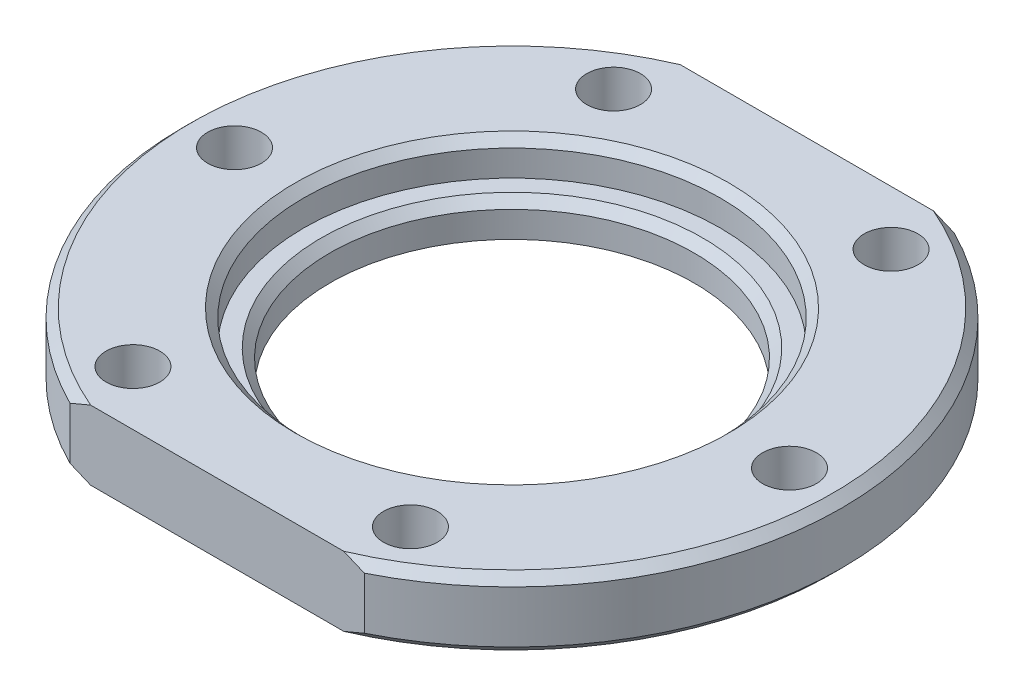
ISO-10303-21;
HEADER;
FILE_DESCRIPTION(('STEP AP214'),'2;1');
FILE_NAME('part.step','',(''),(''),'','','');
FILE_SCHEMA(('AUTOMOTIVE_DESIGN { 1 0 10303 214 1 1 1 1 }'));
ENDSEC;
DATA;
#1=APPLICATION_CONTEXT('core data for automotive mechanical design processes');
#2=APPLICATION_PROTOCOL_DEFINITION('international standard','automotive_design',2000,#1);
#3=PRODUCT_CONTEXT('',#1,'mechanical');
#4=PRODUCT('Part','Part','',(#3));
#5=PRODUCT_RELATED_PRODUCT_CATEGORY('part','',(#4));
#6=PRODUCT_DEFINITION_FORMATION('','',#4);
#7=PRODUCT_DEFINITION_CONTEXT('part definition',#1,'design');
#8=PRODUCT_DEFINITION('design','',#6,#7);
#9=PRODUCT_DEFINITION_SHAPE('','',#8);
#10=(LENGTH_UNIT() NAMED_UNIT(*) SI_UNIT(.MILLI.,.METRE.));
#11=(NAMED_UNIT(*) PLANE_ANGLE_UNIT() SI_UNIT($,.RADIAN.));
#12=(NAMED_UNIT(*) SI_UNIT($,.STERADIAN.) SOLID_ANGLE_UNIT());
#13=UNCERTAINTY_MEASURE_WITH_UNIT(LENGTH_MEASURE(1.E-05),#10,'distance_accuracy_value','');
#14=(GEOMETRIC_REPRESENTATION_CONTEXT(3) GLOBAL_UNCERTAINTY_ASSIGNED_CONTEXT((#13)) GLOBAL_UNIT_ASSIGNED_CONTEXT((#10,
#11,#12)) REPRESENTATION_CONTEXT('',''));
#15=CARTESIAN_POINT('',(0.,0.,0.));
#16=DIRECTION('',(0.,0.,1.));
#17=DIRECTION('',(1.,0.,0.));
#18=AXIS2_PLACEMENT_3D('',#15,#16,#17);
#19=CARTESIAN_POINT('',(0.,4.,0.));
#20=DIRECTION('',(0.,-1.,0.));
#21=DIRECTION('',(0.,0.,-1.));
#22=AXIS2_PLACEMENT_3D('',#19,#20,#21);
#23=CYLINDRICAL_SURFACE('',#22,10.5);
#24=CARTESIAN_POINT('',(0.,1.49999999999999,0.));
#25=DIRECTION('',(0.,1.,0.));
#26=DIRECTION('',(0.,0.,1.));
#27=AXIS2_PLACEMENT_3D('',#24,#25,#26);
#28=CIRCLE('',#27,10.5);
#29=CARTESIAN_POINT('',(0.,1.49999999999999,10.5));
#30=VERTEX_POINT('',#29);
#31=EDGE_CURVE('E148',#30,#30,#28,.T.);
#32=ORIENTED_EDGE('',*,*,#31,.T.);
#33=EDGE_LOOP('',(#32));
#34=FACE_BOUND('',#33,.T.);
#35=CARTESIAN_POINT('',(0.,0.,0.));
#36=DIRECTION('',(0.,1.,0.));
#37=DIRECTION('',(0.,0.,1.));
#38=AXIS2_PLACEMENT_3D('',#35,#36,#37);
#39=CIRCLE('',#38,10.5);
#40=CARTESIAN_POINT('',(0.,0.,10.5));
#41=VERTEX_POINT('',#40);
#42=EDGE_CURVE('E134',#41,#41,#39,.T.);
#43=ORIENTED_EDGE('',*,*,#42,.F.);
#44=EDGE_LOOP('',(#43));
#45=FACE_BOUND('',#44,.T.);
#46=ADVANCED_FACE('F35',(#34,#45),#23,.F.);
#47=CARTESIAN_POINT('',(0.,4.,0.));
#48=DIRECTION('',(0.,1.,0.));
#49=DIRECTION('',(0.,0.,1.));
#50=AXIS2_PLACEMENT_3D('',#47,#48,#49);
#51=PLANE('',#50);
#52=CARTESIAN_POINT('',(0.,4.,0.));
#53=DIRECTION('',(0.,1.,0.));
#54=DIRECTION('',(0.,0.,1.));
#55=AXIS2_PLACEMENT_3D('',#52,#53,#54);
#56=CIRCLE('',#55,12.5);
#57=CARTESIAN_POINT('',(0.,4.,12.5));
#58=VERTEX_POINT('',#57);
#59=EDGE_CURVE('E157',#58,#58,#56,.F.);
#60=ORIENTED_EDGE('',*,*,#59,.T.);
#61=EDGE_LOOP('',(#60));
#62=FACE_BOUND('',#61,.T.);
#63=CARTESIAN_POINT('',(7.99999999999987,4.,13.8564064605511));
#64=DIRECTION('',(0.,1.,0.));
#65=DIRECTION('',(0.,0.,1.));
#66=AXIS2_PLACEMENT_3D('',#63,#64,#65);
#67=CIRCLE('',#66,1.55);
#68=CARTESIAN_POINT('',(7.99999999999987,4.,15.4064064605511));
#69=VERTEX_POINT('',#68);
#70=EDGE_CURVE('E327',#69,#69,#67,.T.);
#71=ORIENTED_EDGE('',*,*,#70,.F.);
#72=EDGE_LOOP('',(#71));
#73=FACE_BOUND('',#72,.T.);
#74=CARTESIAN_POINT('',(8.00000000000007,4.,-13.856406460551));
#75=DIRECTION('',(0.,1.,0.));
#76=DIRECTION('',(0.,0.,1.));
#77=AXIS2_PLACEMENT_3D('',#74,#75,#76);
#78=CIRCLE('',#77,1.55);
#79=CARTESIAN_POINT('',(8.00000000000007,4.,-12.306406460551));
#80=VERTEX_POINT('',#79);
#81=EDGE_CURVE('E339',#80,#80,#78,.T.);
#82=ORIENTED_EDGE('',*,*,#81,.F.);
#83=EDGE_LOOP('',(#82));
#84=FACE_BOUND('',#83,.T.);
#85=CARTESIAN_POINT('',(-16.,4.,0.));
#86=DIRECTION('',(0.,1.,0.));
#87=DIRECTION('',(0.,0.,1.));
#88=AXIS2_PLACEMENT_3D('',#85,#86,#87);
#89=CIRCLE('',#88,1.55);
#90=CARTESIAN_POINT('',(-16.,4.,1.55));
#91=VERTEX_POINT('',#90);
#92=EDGE_CURVE('E351',#91,#91,#89,.T.);
#93=ORIENTED_EDGE('',*,*,#92,.F.);
#94=EDGE_LOOP('',(#93));
#95=FACE_BOUND('',#94,.T.);
#96=DIRECTION('',(1.,0.,0.));
#97=VECTOR('',#96,1.);
#98=CARTESIAN_POINT('',(-8.48528137423857,4.,17.));
#99=LINE('',#98,#97);
#100=CARTESIAN_POINT('',(-7.29725975966325,4.,17.));
#101=VERTEX_POINT('',#100);
#102=CARTESIAN_POINT('',(7.29725975966324,4.,17.));
#103=VERTEX_POINT('',#102);
#104=EDGE_CURVE('E114',#101,#103,#99,.T.);
#105=ORIENTED_EDGE('',*,*,#104,.T.);
#106=CARTESIAN_POINT('',(0.,4.,0.));
#107=DIRECTION('',(0.,1.,0.));
#108=DIRECTION('',(0.,0.,1.));
#109=AXIS2_PLACEMENT_3D('',#106,#107,#108);
#110=CIRCLE('',#109,18.5);
#111=CARTESIAN_POINT('',(7.29725975966324,4.,-17.));
#112=VERTEX_POINT('',#111);
#113=EDGE_CURVE('E118',#103,#112,#110,.T.);
#114=ORIENTED_EDGE('',*,*,#113,.T.);
#115=DIRECTION('',(-1.,0.,0.));
#116=VECTOR('',#115,1.);
#117=CARTESIAN_POINT('',(-8.48528137423857,4.,-17.));
#118=LINE('',#117,#116);
#119=CARTESIAN_POINT('',(-7.29725975966325,4.,-17.));
#120=VERTEX_POINT('',#119);
#121=EDGE_CURVE('E117',#112,#120,#118,.T.);
#122=ORIENTED_EDGE('',*,*,#121,.T.);
#123=CARTESIAN_POINT('',(0.,4.,0.));
#124=DIRECTION('',(0.,1.,0.));
#125=DIRECTION('',(0.,0.,1.));
#126=AXIS2_PLACEMENT_3D('',#123,#124,#125);
#127=CIRCLE('',#126,18.5);
#128=EDGE_CURVE('E105',#120,#101,#127,.T.);
#129=ORIENTED_EDGE('',*,*,#128,.T.);
#130=EDGE_LOOP('',(#105,#114,#122,#129));
#131=FACE_BOUND('',#130,.T.);
#132=CARTESIAN_POINT('',(-7.99999999999997,4.,-13.856406460551));
#133=DIRECTION('',(0.,1.,0.));
#134=DIRECTION('',(0.,0.,1.));
#135=AXIS2_PLACEMENT_3D('',#132,#133,#134);
#136=CIRCLE('',#135,1.55);
#137=CARTESIAN_POINT('',(-7.99999999999997,4.,-12.306406460551));
#138=VERTEX_POINT('',#137);
#139=EDGE_CURVE('E345',#138,#138,#136,.T.);
#140=ORIENTED_EDGE('',*,*,#139,.F.);
#141=EDGE_LOOP('',(#140));
#142=FACE_BOUND('',#141,.T.);
#143=CARTESIAN_POINT('',(16.,4.,1.1172740284298E-13));
#144=DIRECTION('',(0.,1.,0.));
#145=DIRECTION('',(0.,0.,1.));
#146=AXIS2_PLACEMENT_3D('',#143,#144,#145);
#147=CIRCLE('',#146,1.55);
#148=CARTESIAN_POINT('',(16.,4.,1.55000000000011));
#149=VERTEX_POINT('',#148);
#150=EDGE_CURVE('E333',#149,#149,#147,.T.);
#151=ORIENTED_EDGE('',*,*,#150,.F.);
#152=EDGE_LOOP('',(#151));
#153=FACE_BOUND('',#152,.T.);
#154=CARTESIAN_POINT('',(-8.00000000000016,4.,13.8564064605509));
#155=DIRECTION('',(0.,1.,0.));
#156=DIRECTION('',(0.,0.,1.));
#157=AXIS2_PLACEMENT_3D('',#154,#155,#156);
#158=CIRCLE('',#157,1.55);
#159=CARTESIAN_POINT('',(-8.00000000000016,4.,15.4064064605509));
#160=VERTEX_POINT('',#159);
#161=EDGE_CURVE('E321',#160,#160,#158,.T.);
#162=ORIENTED_EDGE('',*,*,#161,.F.);
#163=EDGE_LOOP('',(#162));
#164=FACE_BOUND('',#163,.T.);
#165=ADVANCED_FACE('F111',(#62,#73,#84,#95,#131,#142,#153,#164),#51,.T.);
#166=CARTESIAN_POINT('',(0.,0.,0.));
#167=DIRECTION('',(0.,1.,0.));
#168=DIRECTION('',(0.,0.,1.));
#169=AXIS2_PLACEMENT_3D('',#166,#167,#168);
#170=PLANE('',#169);
#171=DIRECTION('',(-1.,0.,0.));
#172=VECTOR('',#171,1.);
#173=CARTESIAN_POINT('',(-8.48528137423857,0.,-17.));
#174=LINE('',#173,#172);
#175=CARTESIAN_POINT('',(7.29725975966322,0.,-17.));
#176=VERTEX_POINT('',#175);
#177=CARTESIAN_POINT('',(-7.29725975966322,0.,-17.));
#178=VERTEX_POINT('',#177);
#179=EDGE_CURVE('E126',#176,#178,#174,.T.);
#180=ORIENTED_EDGE('',*,*,#179,.F.);
#181=CARTESIAN_POINT('',(0.,0.,0.));
#182=DIRECTION('',(0.,1.,0.));
#183=DIRECTION('',(0.,0.,1.));
#184=AXIS2_PLACEMENT_3D('',#181,#182,#183);
#185=CIRCLE('',#184,18.5);
#186=CARTESIAN_POINT('',(7.29725975966322,0.,17.));
#187=VERTEX_POINT('',#186);
#188=EDGE_CURVE('E106',#176,#187,#185,.F.);
#189=ORIENTED_EDGE('',*,*,#188,.T.);
#190=DIRECTION('',(1.,0.,0.));
#191=VECTOR('',#190,1.);
#192=CARTESIAN_POINT('',(-8.48528137423857,0.,17.));
#193=LINE('',#192,#191);
#194=CARTESIAN_POINT('',(-7.29725975966322,0.,17.));
#195=VERTEX_POINT('',#194);
#196=EDGE_CURVE('E131',#195,#187,#193,.T.);
#197=ORIENTED_EDGE('',*,*,#196,.F.);
#198=CARTESIAN_POINT('',(0.,0.,0.));
#199=DIRECTION('',(0.,1.,0.));
#200=DIRECTION('',(0.,0.,1.));
#201=AXIS2_PLACEMENT_3D('',#198,#199,#200);
#202=CIRCLE('',#201,18.5);
#203=EDGE_CURVE('E250',#195,#178,#202,.F.);
#204=ORIENTED_EDGE('',*,*,#203,.T.);
#205=EDGE_LOOP('',(#180,#189,#197,#204));
#206=FACE_BOUND('',#205,.T.);
#207=ORIENTED_EDGE('',*,*,#42,.T.);
#208=EDGE_LOOP('',(#207));
#209=FACE_BOUND('',#208,.T.);
#210=CARTESIAN_POINT('',(-16.,0.,0.));
#211=DIRECTION('',(0.,1.,0.));
#212=DIRECTION('',(0.,0.,1.));
#213=AXIS2_PLACEMENT_3D('',#210,#211,#212);
#214=CIRCLE('',#213,1.55);
#215=CARTESIAN_POINT('',(-16.,0.,1.55));
#216=VERTEX_POINT('',#215);
#217=EDGE_CURVE('E348',#216,#216,#214,.T.);
#218=ORIENTED_EDGE('',*,*,#217,.T.);
#219=EDGE_LOOP('',(#218));
#220=FACE_BOUND('',#219,.T.);
#221=CARTESIAN_POINT('',(-7.99999999999997,0.,-13.856406460551));
#222=DIRECTION('',(0.,1.,0.));
#223=DIRECTION('',(0.,0.,1.));
#224=AXIS2_PLACEMENT_3D('',#221,#222,#223);
#225=CIRCLE('',#224,1.55);
#226=CARTESIAN_POINT('',(-7.99999999999997,0.,-12.306406460551));
#227=VERTEX_POINT('',#226);
#228=EDGE_CURVE('E342',#227,#227,#225,.T.);
#229=ORIENTED_EDGE('',*,*,#228,.T.);
#230=EDGE_LOOP('',(#229));
#231=FACE_BOUND('',#230,.T.);
#232=CARTESIAN_POINT('',(8.00000000000007,0.,-13.856406460551));
#233=DIRECTION('',(0.,1.,0.));
#234=DIRECTION('',(0.,0.,1.));
#235=AXIS2_PLACEMENT_3D('',#232,#233,#234);
#236=CIRCLE('',#235,1.55);
#237=CARTESIAN_POINT('',(8.00000000000007,0.,-12.306406460551));
#238=VERTEX_POINT('',#237);
#239=EDGE_CURVE('E336',#238,#238,#236,.T.);
#240=ORIENTED_EDGE('',*,*,#239,.T.);
#241=EDGE_LOOP('',(#240));
#242=FACE_BOUND('',#241,.T.);
#243=CARTESIAN_POINT('',(16.,0.,1.1172740284298E-13));
#244=DIRECTION('',(0.,1.,0.));
#245=DIRECTION('',(0.,0.,1.));
#246=AXIS2_PLACEMENT_3D('',#243,#244,#245);
#247=CIRCLE('',#246,1.55);
#248=CARTESIAN_POINT('',(16.,0.,1.55000000000011));
#249=VERTEX_POINT('',#248);
#250=EDGE_CURVE('E330',#249,#249,#247,.T.);
#251=ORIENTED_EDGE('',*,*,#250,.T.);
#252=EDGE_LOOP('',(#251));
#253=FACE_BOUND('',#252,.T.);
#254=CARTESIAN_POINT('',(7.99999999999987,0.,13.8564064605511));
#255=DIRECTION('',(0.,1.,0.));
#256=DIRECTION('',(0.,0.,1.));
#257=AXIS2_PLACEMENT_3D('',#254,#255,#256);
#258=CIRCLE('',#257,1.55);
#259=CARTESIAN_POINT('',(7.99999999999987,0.,15.4064064605511));
#260=VERTEX_POINT('',#259);
#261=EDGE_CURVE('E325',#260,#260,#258,.T.);
#262=ORIENTED_EDGE('',*,*,#261,.T.);
#263=EDGE_LOOP('',(#262));
#264=FACE_BOUND('',#263,.T.);
#265=CARTESIAN_POINT('',(-8.00000000000016,0.,13.8564064605509));
#266=DIRECTION('',(0.,1.,0.));
#267=DIRECTION('',(0.,0.,1.));
#268=AXIS2_PLACEMENT_3D('',#265,#266,#267);
#269=CIRCLE('',#268,1.55);
#270=CARTESIAN_POINT('',(-8.00000000000016,0.,15.4064064605509));
#271=VERTEX_POINT('',#270);
#272=EDGE_CURVE('E318',#271,#271,#269,.T.);
#273=ORIENTED_EDGE('',*,*,#272,.T.);
#274=EDGE_LOOP('',(#273));
#275=FACE_BOUND('',#274,.T.);
#276=ADVANCED_FACE('F186',(#206,#209,#220,#231,#242,#253,#264,#275),#170,.F.);
#277=CARTESIAN_POINT('',(0.,4.,0.));
#278=DIRECTION('',(0.,-1.,0.));
#279=DIRECTION('',(0.,0.,-1.));
#280=AXIS2_PLACEMENT_3D('',#277,#278,#279);
#281=CYLINDRICAL_SURFACE('',#280,19.);
#282=DIRECTION('',(0.,-1.,0.));
#283=VECTOR('',#282,1.);
#284=CARTESIAN_POINT('',(-8.48528137423857,4.,-17.));
#285=LINE('',#284,#283);
#286=CARTESIAN_POINT('',(-8.48528137423857,3.50000000000001,-17.));
#287=VERTEX_POINT('',#286);
#288=CARTESIAN_POINT('',(-8.48528137423857,0.499999999999997,-17.));
#289=VERTEX_POINT('',#288);
#290=EDGE_CURVE('E128',#287,#289,#285,.T.);
#291=ORIENTED_EDGE('',*,*,#290,.T.);
#292=CARTESIAN_POINT('',(0.,0.499999999999997,0.));
#293=DIRECTION('',(0.,1.,0.));
#294=DIRECTION('',(0.,0.,1.));
#295=AXIS2_PLACEMENT_3D('',#292,#293,#294);
#296=CIRCLE('',#295,19.);
#297=CARTESIAN_POINT('',(-8.48528137423857,0.499999999999997,17.));
#298=VERTEX_POINT('',#297);
#299=EDGE_CURVE('E11',#289,#298,#296,.T.);
#300=ORIENTED_EDGE('',*,*,#299,.T.);
#301=DIRECTION('',(0.,-1.,0.));
#302=VECTOR('',#301,1.);
#303=CARTESIAN_POINT('',(-8.48528137423857,4.,17.));
#304=LINE('',#303,#302);
#305=CARTESIAN_POINT('',(-8.48528137423857,3.50000000000001,17.));
#306=VERTEX_POINT('',#305);
#307=EDGE_CURVE('E146',#306,#298,#304,.T.);
#308=ORIENTED_EDGE('',*,*,#307,.F.);
#309=CARTESIAN_POINT('',(0.,3.50000000000001,0.));
#310=DIRECTION('',(0.,1.,0.));
#311=DIRECTION('',(0.,0.,1.));
#312=AXIS2_PLACEMENT_3D('',#309,#310,#311);
#313=CIRCLE('',#312,19.);
#314=EDGE_CURVE('E45',#306,#287,#313,.F.);
#315=ORIENTED_EDGE('',*,*,#314,.T.);
#316=EDGE_LOOP('',(#291,#300,#308,#315));
#317=FACE_BOUND('',#316,.T.);
#318=ADVANCED_FACE('F240',(#317),#281,.T.);
#319=CARTESIAN_POINT('',(-8.48528137423857,4.,17.));
#320=DIRECTION('',(0.,0.,-1.));
#321=DIRECTION('',(-1.,0.,0.));
#322=AXIS2_PLACEMENT_3D('',#319,#320,#321);
#323=PLANE('',#322);
#324=ORIENTED_EDGE('',*,*,#196,.T.);
#325=CARTESIAN_POINT('',(7.29725975966322,0.,17.));
#326=CARTESIAN_POINT('',(7.39719487948352,0.0394191850347753,17.));
#327=CARTESIAN_POINT('',(7.4968962262143,0.0794296704768808,17.));
#328=CARTESIAN_POINT('',(7.69582202053383,0.160584933755773,17.));
#329=CARTESIAN_POINT('',(7.79504652511087,0.201729571878801,17.));
#330=CARTESIAN_POINT('',(7.99303326311037,0.285114298994633,17.));
#331=CARTESIAN_POINT('',(8.09179549900561,0.327354382119744,17.));
#332=CARTESIAN_POINT('',(8.2888745500227,0.412894043845014,17.));
#333=CARTESIAN_POINT('',(8.38719130902525,0.456193751762999,17.));
#334=CARTESIAN_POINT('',(8.48528137423857,0.499999999999986,17.));
#335=B_SPLINE_CURVE_WITH_KNOTS('',3,(#325,#326,#327,#328,#329,#330,#331,#332,#333,#334),
.UNSPECIFIED.,.F.,.F.,(4,2,2,2,4),(0.,0.322283148753811,0.644526772037848,0.966768669597223,
1.28905009200687),.UNSPECIFIED.);
#336=CARTESIAN_POINT('',(8.48528137423857,0.499999999999997,17.));
#337=VERTEX_POINT('',#336);
#338=EDGE_CURVE('E228',#187,#337,#335,.T.);
#339=ORIENTED_EDGE('',*,*,#338,.T.);
#340=DIRECTION('',(0.,-1.,0.));
#341=VECTOR('',#340,1.);
#342=CARTESIAN_POINT('',(8.48528137423857,4.,17.));
#343=LINE('',#342,#341);
#344=CARTESIAN_POINT('',(8.48528137423857,3.50000000000001,17.));
#345=VERTEX_POINT('',#344);
#346=EDGE_CURVE('E143',#345,#337,#343,.T.);
#347=ORIENTED_EDGE('',*,*,#346,.F.);
#348=CARTESIAN_POINT('',(8.48528137423857,3.50000000000001,17.));
#349=CARTESIAN_POINT('',(8.38719130902525,3.543806248237,17.));
#350=CARTESIAN_POINT('',(8.2888745500227,3.58710595615499,17.));
#351=CARTESIAN_POINT('',(8.09179549900562,3.67264561788026,17.));
#352=CARTESIAN_POINT('',(7.99303326311038,3.71488570100537,17.));
#353=CARTESIAN_POINT('',(7.79504652511089,3.7982704281212,17.));
#354=CARTESIAN_POINT('',(7.69582202053385,3.83941506624423,17.));
#355=CARTESIAN_POINT('',(7.49689622621432,3.92057032952313,17.));
#356=CARTESIAN_POINT('',(7.39719487948355,3.96058081496524,17.));
#357=CARTESIAN_POINT('',(7.29725975966326,4.00000000000003,17.));
#358=B_SPLINE_CURVE_WITH_KNOTS('',3,(#348,#349,#350,#351,#352,#353,#354,#355,#356,#357),
.UNSPECIFIED.,.F.,.F.,(4,2,2,2,4),(0.,0.322281422409644,0.644523319969013,0.966766943253042,
1.28905009200685),.UNSPECIFIED.);
#359=EDGE_CURVE('E125',#345,#103,#358,.T.);
#360=ORIENTED_EDGE('',*,*,#359,.T.);
#361=ORIENTED_EDGE('',*,*,#104,.F.);
#362=CARTESIAN_POINT('',(-7.29725975966325,4.,17.));
#363=CARTESIAN_POINT('',(-7.39719487948355,3.96058081496523,17.));
#364=CARTESIAN_POINT('',(-7.49689622621433,3.92057032952312,17.));
#365=CARTESIAN_POINT('',(-7.69582202053386,3.83941506624423,17.));
#366=CARTESIAN_POINT('',(-7.79504652511089,3.7982704281212,17.));
#367=CARTESIAN_POINT('',(-7.99303326311039,3.71488570100537,17.));
#368=CARTESIAN_POINT('',(-8.09179549900562,3.67264561788026,17.));
#369=CARTESIAN_POINT('',(-8.2888745500227,3.58710595615499,17.));
#370=CARTESIAN_POINT('',(-8.38719130902525,3.543806248237,17.));
#371=CARTESIAN_POINT('',(-8.48528137423857,3.50000000000002,17.));
#372=B_SPLINE_CURVE_WITH_KNOTS('',3,(#362,#363,#364,#365,#366,#367,#368,#369,#370,#371),
.UNSPECIFIED.,.F.,.F.,(4,2,2,2,4),(0.,0.322283148753804,0.644526772037832,0.9667686695972,
1.28905009200684),.UNSPECIFIED.);
#373=EDGE_CURVE('E59',#101,#306,#372,.T.);
#374=ORIENTED_EDGE('',*,*,#373,.T.);
#375=ORIENTED_EDGE('',*,*,#307,.T.);
#376=CARTESIAN_POINT('',(-8.48528137423857,0.499999999999997,17.));
#377=CARTESIAN_POINT('',(-8.38719130902525,0.456193751763005,17.));
#378=CARTESIAN_POINT('',(-8.28887455002269,0.412894043845016,17.));
#379=CARTESIAN_POINT('',(-8.09179549900561,0.327354382119743,17.));
#380=CARTESIAN_POINT('',(-7.99303326311037,0.285114298994632,17.));
#381=CARTESIAN_POINT('',(-7.79504652511087,0.201729571878802,17.));
#382=CARTESIAN_POINT('',(-7.69582202053383,0.160584933755776,17.));
#383=CARTESIAN_POINT('',(-7.4968962262143,0.0794296704768802,17.));
#384=CARTESIAN_POINT('',(-7.39719487948352,0.0394191850347685,17.));
#385=CARTESIAN_POINT('',(-7.29725975966323,0.,17.));
#386=B_SPLINE_CURVE_WITH_KNOTS('',3,(#376,#377,#378,#379,#380,#381,#382,#383,#384,#385),
.UNSPECIFIED.,.F.,.F.,(4,2,2,2,4),(0.,0.32228142240965,0.644523319969026,0.966766943253061,
1.28905009200687),.UNSPECIFIED.);
#387=EDGE_CURVE('E52',#298,#195,#386,.T.);
#388=ORIENTED_EDGE('',*,*,#387,.T.);
#389=EDGE_LOOP('',(#324,#339,#347,#360,#361,#374,#375,#388));
#390=FACE_BOUND('',#389,.T.);
#391=ADVANCED_FACE('F122',(#390),#323,.F.);
#392=CARTESIAN_POINT('',(0.,4.,0.));
#393=DIRECTION('',(0.,-1.,0.));
#394=DIRECTION('',(0.,0.,-1.));
#395=AXIS2_PLACEMENT_3D('',#392,#393,#394);
#396=CYLINDRICAL_SURFACE('',#395,19.);
#397=ORIENTED_EDGE('',*,*,#346,.T.);
#398=CARTESIAN_POINT('',(0.,0.499999999999997,0.));
#399=DIRECTION('',(0.,1.,0.));
#400=DIRECTION('',(0.,0.,1.));
#401=AXIS2_PLACEMENT_3D('',#398,#399,#400);
#402=CIRCLE('',#401,19.);
#403=CARTESIAN_POINT('',(8.48528137423856,0.499999999999997,-17.));
#404=VERTEX_POINT('',#403);
#405=EDGE_CURVE('E162',#337,#404,#402,.T.);
#406=ORIENTED_EDGE('',*,*,#405,.T.);
#407=DIRECTION('',(0.,-1.,0.));
#408=VECTOR('',#407,1.);
#409=CARTESIAN_POINT('',(8.48528137423856,4.,-17.));
#410=LINE('',#409,#408);
#411=CARTESIAN_POINT('',(8.48528137423856,3.50000000000001,-17.));
#412=VERTEX_POINT('',#411);
#413=EDGE_CURVE('E140',#412,#404,#410,.T.);
#414=ORIENTED_EDGE('',*,*,#413,.F.);
#415=CARTESIAN_POINT('',(0.,3.50000000000001,0.));
#416=DIRECTION('',(0.,1.,0.));
#417=DIRECTION('',(0.,0.,1.));
#418=AXIS2_PLACEMENT_3D('',#415,#416,#417);
#419=CIRCLE('',#418,19.);
#420=EDGE_CURVE('E160',#412,#345,#419,.F.);
#421=ORIENTED_EDGE('',*,*,#420,.T.);
#422=EDGE_LOOP('',(#397,#406,#414,#421));
#423=FACE_BOUND('',#422,.T.);
#424=ADVANCED_FACE('F184',(#423),#396,.T.);
#425=CARTESIAN_POINT('',(-8.48528137423857,4.,-17.));
#426=DIRECTION('',(0.,0.,1.));
#427=DIRECTION('',(1.,0.,0.));
#428=AXIS2_PLACEMENT_3D('',#425,#426,#427);
#429=PLANE('',#428);
#430=ORIENTED_EDGE('',*,*,#413,.T.);
#431=CARTESIAN_POINT('',(8.48528137423856,0.499999999999997,-17.));
#432=CARTESIAN_POINT('',(8.38719130902525,0.456193751763001,-17.));
#433=CARTESIAN_POINT('',(8.28887455002269,0.412894043845012,-17.));
#434=CARTESIAN_POINT('',(8.09179549900561,0.327354382119741,-17.));
#435=CARTESIAN_POINT('',(7.99303326311037,0.285114298994632,-17.));
#436=CARTESIAN_POINT('',(7.79504652511087,0.201729571878802,-17.));
#437=CARTESIAN_POINT('',(7.69582202053383,0.160584933755774,-17.));
#438=CARTESIAN_POINT('',(7.4968962262143,0.0794296704768765,-17.));
#439=CARTESIAN_POINT('',(7.39719487948352,0.0394191850347649,-17.));
#440=CARTESIAN_POINT('',(7.29725975966323,0.,-17.));
#441=B_SPLINE_CURVE_WITH_KNOTS('',3,(#431,#432,#433,#434,#435,#436,#437,#438,#439,#440),
.UNSPECIFIED.,.F.,.F.,(4,2,2,2,4),(0.,0.322281422409649,0.644523319969026,0.966766943253061,
1.28905009200687),.UNSPECIFIED.);
#442=EDGE_CURVE('E199',#404,#176,#441,.T.);
#443=ORIENTED_EDGE('',*,*,#442,.T.);
#444=ORIENTED_EDGE('',*,*,#179,.T.);
#445=CARTESIAN_POINT('',(-7.29725975966322,0.,-17.));
#446=CARTESIAN_POINT('',(-7.39719487948352,0.0394191850347753,-17.));
#447=CARTESIAN_POINT('',(-7.4968962262143,0.0794296704768808,-17.));
#448=CARTESIAN_POINT('',(-7.69582202053383,0.160584933755773,-17.));
#449=CARTESIAN_POINT('',(-7.79504652511087,0.201729571878801,-17.));
#450=CARTESIAN_POINT('',(-7.99303326311037,0.285114298994633,-17.));
#451=CARTESIAN_POINT('',(-8.09179549900561,0.327354382119744,-17.));
#452=CARTESIAN_POINT('',(-8.2888745500227,0.412894043845014,-17.));
#453=CARTESIAN_POINT('',(-8.38719130902525,0.456193751762999,-17.));
#454=CARTESIAN_POINT('',(-8.48528137423857,0.499999999999986,-17.));
#455=B_SPLINE_CURVE_WITH_KNOTS('',3,(#445,#446,#447,#448,#449,#450,#451,#452,#453,#454),
.UNSPECIFIED.,.F.,.F.,(4,2,2,2,4),(0.,0.322283148753811,0.644526772037848,0.966768669597223,
1.28905009200687),.UNSPECIFIED.);
#456=EDGE_CURVE('E172',#178,#289,#455,.T.);
#457=ORIENTED_EDGE('',*,*,#456,.T.);
#458=ORIENTED_EDGE('',*,*,#290,.F.);
#459=CARTESIAN_POINT('',(-8.48528137423857,3.50000000000001,-17.));
#460=CARTESIAN_POINT('',(-8.38719130902525,3.543806248237,-17.));
#461=CARTESIAN_POINT('',(-8.2888745500227,3.58710595615499,-17.));
#462=CARTESIAN_POINT('',(-8.09179549900563,3.67264561788026,-17.));
#463=CARTESIAN_POINT('',(-7.99303326311039,3.71488570100537,-17.));
#464=CARTESIAN_POINT('',(-7.79504652511089,3.7982704281212,-17.));
#465=CARTESIAN_POINT('',(-7.69582202053386,3.83941506624423,-17.));
#466=CARTESIAN_POINT('',(-7.49689622621433,3.92057032952312,-17.));
#467=CARTESIAN_POINT('',(-7.39719487948355,3.96058081496524,-17.));
#468=CARTESIAN_POINT('',(-7.29725975966326,4.00000000000003,-17.));
#469=B_SPLINE_CURVE_WITH_KNOTS('',3,(#459,#460,#461,#462,#463,#464,#465,#466,#467,#468),
.UNSPECIFIED.,.F.,.F.,(4,2,2,2,4),(0.,0.32228142240964,0.644523319969009,0.966766943253038,
1.28905009200684),.UNSPECIFIED.);
#470=EDGE_CURVE('E165',#287,#120,#469,.T.);
#471=ORIENTED_EDGE('',*,*,#470,.T.);
#472=ORIENTED_EDGE('',*,*,#121,.F.);
#473=CARTESIAN_POINT('',(7.29725975966324,4.,-17.));
#474=CARTESIAN_POINT('',(7.39719487948354,3.96058081496523,-17.));
#475=CARTESIAN_POINT('',(7.49689622621432,3.92057032952313,-17.));
#476=CARTESIAN_POINT('',(7.69582202053385,3.83941506624423,-17.));
#477=CARTESIAN_POINT('',(7.79504652511088,3.7982704281212,-17.));
#478=CARTESIAN_POINT('',(7.99303326311038,3.71488570100537,-17.));
#479=CARTESIAN_POINT('',(8.09179549900562,3.67264561788026,-17.));
#480=CARTESIAN_POINT('',(8.2888745500227,3.58710595615499,-17.));
#481=CARTESIAN_POINT('',(8.38719130902525,3.54380624823701,-17.));
#482=CARTESIAN_POINT('',(8.48528137423857,3.50000000000002,-17.));
#483=B_SPLINE_CURVE_WITH_KNOTS('',3,(#473,#474,#475,#476,#477,#478,#479,#480,#481,#482),
.UNSPECIFIED.,.F.,.F.,(4,2,2,2,4),(0.,0.322283148753804,0.644526772037834,0.966768669597203,
1.28905009200684),.UNSPECIFIED.);
#484=EDGE_CURVE('E193',#112,#412,#483,.T.);
#485=ORIENTED_EDGE('',*,*,#484,.T.);
#486=EDGE_LOOP('',(#430,#443,#444,#457,#458,#471,#472,#485));
#487=FACE_BOUND('',#486,.T.);
#488=ADVANCED_FACE('F178',(#487),#429,.F.);
#489=CARTESIAN_POINT('',(-16.,4.,0.));
#490=DIRECTION('',(0.,-1.,0.));
#491=DIRECTION('',(0.,0.,-1.));
#492=AXIS2_PLACEMENT_3D('',#489,#490,#491);
#493=CYLINDRICAL_SURFACE('',#492,1.55);
#494=ORIENTED_EDGE('',*,*,#92,.T.);
#495=EDGE_LOOP('',(#494));
#496=FACE_BOUND('',#495,.T.);
#497=ORIENTED_EDGE('',*,*,#217,.F.);
#498=EDGE_LOOP('',(#497));
#499=FACE_BOUND('',#498,.T.);
#500=ADVANCED_FACE('F183',(#496,#499),#493,.F.);
#501=CARTESIAN_POINT('',(-7.99999999999997,4.,-13.856406460551));
#502=DIRECTION('',(0.,-1.,0.));
#503=DIRECTION('',(0.,0.,-1.));
#504=AXIS2_PLACEMENT_3D('',#501,#502,#503);
#505=CYLINDRICAL_SURFACE('',#504,1.55);
#506=ORIENTED_EDGE('',*,*,#139,.T.);
#507=EDGE_LOOP('',(#506));
#508=FACE_BOUND('',#507,.T.);
#509=ORIENTED_EDGE('',*,*,#228,.F.);
#510=EDGE_LOOP('',(#509));
#511=FACE_BOUND('',#510,.T.);
#512=ADVANCED_FACE('F278',(#508,#511),#505,.F.);
#513=CARTESIAN_POINT('',(8.00000000000007,4.,-13.856406460551));
#514=DIRECTION('',(0.,-1.,0.));
#515=DIRECTION('',(0.,0.,-1.));
#516=AXIS2_PLACEMENT_3D('',#513,#514,#515);
#517=CYLINDRICAL_SURFACE('',#516,1.55);
#518=ORIENTED_EDGE('',*,*,#81,.T.);
#519=EDGE_LOOP('',(#518));
#520=FACE_BOUND('',#519,.T.);
#521=ORIENTED_EDGE('',*,*,#239,.F.);
#522=EDGE_LOOP('',(#521));
#523=FACE_BOUND('',#522,.T.);
#524=ADVANCED_FACE('F282',(#520,#523),#517,.F.);
#525=CARTESIAN_POINT('',(16.,4.,1.1172740284298E-13));
#526=DIRECTION('',(0.,-1.,0.));
#527=DIRECTION('',(0.,0.,-1.));
#528=AXIS2_PLACEMENT_3D('',#525,#526,#527);
#529=CYLINDRICAL_SURFACE('',#528,1.55);
#530=ORIENTED_EDGE('',*,*,#150,.T.);
#531=EDGE_LOOP('',(#530));
#532=FACE_BOUND('',#531,.T.);
#533=ORIENTED_EDGE('',*,*,#250,.F.);
#534=EDGE_LOOP('',(#533));
#535=FACE_BOUND('',#534,.T.);
#536=ADVANCED_FACE('F286',(#532,#535),#529,.F.);
#537=CARTESIAN_POINT('',(7.99999999999987,4.,13.8564064605511));
#538=DIRECTION('',(0.,-1.,0.));
#539=DIRECTION('',(0.,0.,-1.));
#540=AXIS2_PLACEMENT_3D('',#537,#538,#539);
#541=CYLINDRICAL_SURFACE('',#540,1.55);
#542=ORIENTED_EDGE('',*,*,#70,.T.);
#543=EDGE_LOOP('',(#542));
#544=FACE_BOUND('',#543,.T.);
#545=ORIENTED_EDGE('',*,*,#261,.F.);
#546=EDGE_LOOP('',(#545));
#547=FACE_BOUND('',#546,.T.);
#548=ADVANCED_FACE('F290',(#544,#547),#541,.F.);
#549=CARTESIAN_POINT('',(-8.00000000000016,4.,13.8564064605509));
#550=DIRECTION('',(0.,-1.,0.));
#551=DIRECTION('',(0.,0.,-1.));
#552=AXIS2_PLACEMENT_3D('',#549,#550,#551);
#553=CYLINDRICAL_SURFACE('',#552,1.55);
#554=ORIENTED_EDGE('',*,*,#161,.T.);
#555=EDGE_LOOP('',(#554));
#556=FACE_BOUND('',#555,.T.);
#557=ORIENTED_EDGE('',*,*,#272,.F.);
#558=EDGE_LOOP('',(#557));
#559=FACE_BOUND('',#558,.T.);
#560=ADVANCED_FACE('F294',(#556,#559),#553,.F.);
#561=CARTESIAN_POINT('',(0.,2.,0.));
#562=DIRECTION('',(0.,1.,0.));
#563=DIRECTION('',(0.,0.,1.));
#564=AXIS2_PLACEMENT_3D('',#561,#562,#563);
#565=CYLINDRICAL_SURFACE('',#564,12.);
#566=CARTESIAN_POINT('',(0.,3.49999999999999,0.));
#567=DIRECTION('',(0.,1.,0.));
#568=DIRECTION('',(0.,0.,1.));
#569=AXIS2_PLACEMENT_3D('',#566,#567,#568);
#570=CIRCLE('',#569,12.);
#571=CARTESIAN_POINT('',(0.,3.49999999999999,12.));
#572=VERTEX_POINT('',#571);
#573=EDGE_CURVE('E119',#572,#572,#570,.T.);
#574=ORIENTED_EDGE('',*,*,#573,.T.);
#575=EDGE_LOOP('',(#574));
#576=FACE_BOUND('',#575,.T.);
#577=CARTESIAN_POINT('',(0.,2.,0.));
#578=DIRECTION('',(0.,1.,0.));
#579=DIRECTION('',(0.,0.,1.));
#580=AXIS2_PLACEMENT_3D('',#577,#578,#579);
#581=CIRCLE('',#580,12.);
#582=CARTESIAN_POINT('',(0.,2.,12.));
#583=VERTEX_POINT('',#582);
#584=EDGE_CURVE('E316',#583,#583,#581,.T.);
#585=ORIENTED_EDGE('',*,*,#584,.F.);
#586=EDGE_LOOP('',(#585));
#587=FACE_BOUND('',#586,.T.);
#588=ADVANCED_FACE('F298',(#576,#587),#565,.F.);
#589=CARTESIAN_POINT('',(0.,2.,0.));
#590=DIRECTION('',(0.,1.,0.));
#591=DIRECTION('',(0.,0.,1.));
#592=AXIS2_PLACEMENT_3D('',#589,#590,#591);
#593=PLANE('',#592);
#594=CARTESIAN_POINT('',(0.,2.,0.));
#595=DIRECTION('',(0.,1.,0.));
#596=DIRECTION('',(0.,0.,1.));
#597=AXIS2_PLACEMENT_3D('',#594,#595,#596);
#598=CIRCLE('',#597,11.);
#599=CARTESIAN_POINT('',(0.,2.,11.));
#600=VERTEX_POINT('',#599);
#601=EDGE_CURVE('E151',#600,#600,#598,.F.);
#602=ORIENTED_EDGE('',*,*,#601,.T.);
#603=EDGE_LOOP('',(#602));
#604=FACE_BOUND('',#603,.T.);
#605=ORIENTED_EDGE('',*,*,#584,.T.);
#606=EDGE_LOOP('',(#605));
#607=FACE_BOUND('',#606,.T.);
#608=ADVANCED_FACE('F302',(#604,#607),#593,.T.);
#609=CARTESIAN_POINT('',(0.,1.49999999999999,0.));
#610=DIRECTION('',(0.,1.,0.));
#611=DIRECTION('',(0.,0.,1.));
#612=AXIS2_PLACEMENT_3D('',#609,#610,#611);
#613=CONICAL_SURFACE('',#612,10.5,0.785398163397452);
#614=ORIENTED_EDGE('',*,*,#601,.F.);
#615=EDGE_LOOP('',(#614));
#616=FACE_BOUND('',#615,.T.);
#617=ORIENTED_EDGE('',*,*,#31,.F.);
#618=EDGE_LOOP('',(#617));
#619=FACE_BOUND('',#618,.T.);
#620=ADVANCED_FACE('F305',(#616,#619),#613,.F.);
#621=CARTESIAN_POINT('',(0.,3.49999999999999,0.));
#622=DIRECTION('',(0.,1.,0.));
#623=DIRECTION('',(0.,0.,1.));
#624=AXIS2_PLACEMENT_3D('',#621,#622,#623);
#625=CONICAL_SURFACE('',#624,12.,0.785398163397455);
#626=ORIENTED_EDGE('',*,*,#59,.F.);
#627=EDGE_LOOP('',(#626));
#628=FACE_BOUND('',#627,.T.);
#629=ORIENTED_EDGE('',*,*,#573,.F.);
#630=EDGE_LOOP('',(#629));
#631=FACE_BOUND('',#630,.T.);
#632=ADVANCED_FACE('F310',(#628,#631),#625,.F.);
#633=CARTESIAN_POINT('',(0.,0.499999999999997,0.));
#634=DIRECTION('',(0.,1.,0.));
#635=DIRECTION('',(0.,0.,1.));
#636=AXIS2_PLACEMENT_3D('',#633,#634,#635);
#637=CONICAL_SURFACE('',#636,19.,0.785398163397452);
#638=ORIENTED_EDGE('',*,*,#338,.F.);
#639=ORIENTED_EDGE('',*,*,#188,.F.);
#640=ORIENTED_EDGE('',*,*,#442,.F.);
#641=ORIENTED_EDGE('',*,*,#405,.F.);
#642=EDGE_LOOP('',(#638,#639,#640,#641));
#643=FACE_BOUND('',#642,.T.);
#644=ADVANCED_FACE('F215',(#643),#637,.T.);
#645=CARTESIAN_POINT('',(0.,4.,0.));
#646=DIRECTION('',(0.,-1.,0.));
#647=DIRECTION('',(0.,0.,-1.));
#648=AXIS2_PLACEMENT_3D('',#645,#646,#647);
#649=CONICAL_SURFACE('',#648,18.5,0.785398163397438);
#650=ORIENTED_EDGE('',*,*,#359,.F.);
#651=ORIENTED_EDGE('',*,*,#420,.F.);
#652=ORIENTED_EDGE('',*,*,#484,.F.);
#653=ORIENTED_EDGE('',*,*,#113,.F.);
#654=EDGE_LOOP('',(#650,#651,#652,#653));
#655=FACE_BOUND('',#654,.T.);
#656=ADVANCED_FACE('F207',(#655),#649,.T.);
#657=CARTESIAN_POINT('',(0.,0.499999999999997,0.));
#658=DIRECTION('',(0.,1.,0.));
#659=DIRECTION('',(0.,0.,1.));
#660=AXIS2_PLACEMENT_3D('',#657,#658,#659);
#661=CONICAL_SURFACE('',#660,19.,0.785398163397452);
#662=ORIENTED_EDGE('',*,*,#456,.F.);
#663=ORIENTED_EDGE('',*,*,#203,.F.);
#664=ORIENTED_EDGE('',*,*,#387,.F.);
#665=ORIENTED_EDGE('',*,*,#299,.F.);
#666=EDGE_LOOP('',(#662,#663,#664,#665));
#667=FACE_BOUND('',#666,.T.);
#668=ADVANCED_FACE('F214',(#667),#661,.T.);
#669=CARTESIAN_POINT('',(0.,4.,0.));
#670=DIRECTION('',(0.,-1.,0.));
#671=DIRECTION('',(0.,0.,-1.));
#672=AXIS2_PLACEMENT_3D('',#669,#670,#671);
#673=CONICAL_SURFACE('',#672,18.5,0.785398163397438);
#674=ORIENTED_EDGE('',*,*,#470,.F.);
#675=ORIENTED_EDGE('',*,*,#314,.F.);
#676=ORIENTED_EDGE('',*,*,#373,.F.);
#677=ORIENTED_EDGE('',*,*,#128,.F.);
#678=EDGE_LOOP('',(#674,#675,#676,#677));
#679=FACE_BOUND('',#678,.T.);
#680=ADVANCED_FACE('F38',(#679),#673,.T.);
#681=CLOSED_SHELL('',(#46,#165,#276,#318,#391,#424,#488,#500,#512,#524,#536,#548,#560,#588,#608,
#620,#632,#644,#656,#668,#680));
#682=MANIFOLD_SOLID_BREP('B2',#681);
#683=ADVANCED_BREP_SHAPE_REPRESENTATION('',(#18,#682),#14);
#684=SHAPE_DEFINITION_REPRESENTATION(#9,#683);
ENDSEC;
END-ISO-10303-21;
